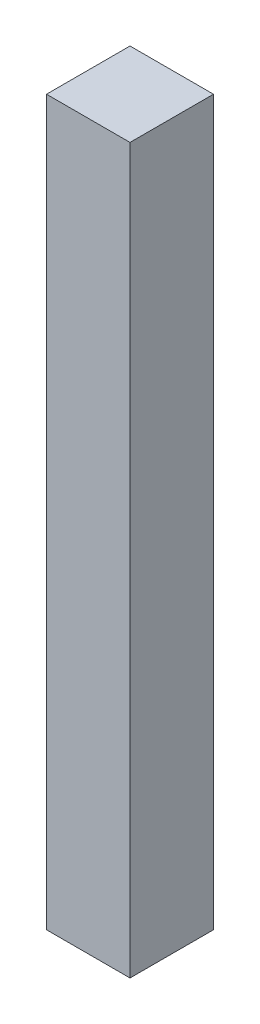
ISO-10303-21;
HEADER;
FILE_DESCRIPTION(('STEP AP214'),'2;1');
FILE_NAME('part.step','',(''),(''),'','','');
FILE_SCHEMA(('AUTOMOTIVE_DESIGN { 1 0 10303 214 1 1 1 1 }'));
ENDSEC;
DATA;
#1=APPLICATION_CONTEXT('core data for automotive mechanical design processes');
#2=APPLICATION_PROTOCOL_DEFINITION('international standard','automotive_design',2000,#1);
#3=PRODUCT_CONTEXT('',#1,'mechanical');
#4=PRODUCT('Part','Part','',(#3));
#5=PRODUCT_RELATED_PRODUCT_CATEGORY('part','',(#4));
#6=PRODUCT_DEFINITION_FORMATION('','',#4);
#7=PRODUCT_DEFINITION_CONTEXT('part definition',#1,'design');
#8=PRODUCT_DEFINITION('design','',#6,#7);
#9=PRODUCT_DEFINITION_SHAPE('','',#8);
#10=(LENGTH_UNIT() NAMED_UNIT(*) SI_UNIT(.MILLI.,.METRE.));
#11=(NAMED_UNIT(*) PLANE_ANGLE_UNIT() SI_UNIT($,.RADIAN.));
#12=(NAMED_UNIT(*) SI_UNIT($,.STERADIAN.) SOLID_ANGLE_UNIT());
#13=UNCERTAINTY_MEASURE_WITH_UNIT(LENGTH_MEASURE(1.E-05),#10,'distance_accuracy_value','');
#14=(GEOMETRIC_REPRESENTATION_CONTEXT(3) GLOBAL_UNCERTAINTY_ASSIGNED_CONTEXT((#13)) GLOBAL_UNIT_ASSIGNED_CONTEXT((#10,
#11,#12)) REPRESENTATION_CONTEXT('',''));
#15=CARTESIAN_POINT('',(0.,0.,0.));
#16=DIRECTION('',(0.,0.,1.));
#17=DIRECTION('',(1.,0.,0.));
#18=AXIS2_PLACEMENT_3D('',#15,#16,#17);
#19=CARTESIAN_POINT('',(-40.0481927710843,260.,-5.36746987951807));
#20=DIRECTION('',(1.,0.,0.));
#21=DIRECTION('',(0.,0.,-1.));
#22=AXIS2_PLACEMENT_3D('',#19,#20,#21);
#23=PLANE('',#22);
#24=DIRECTION('',(0.,0.,1.));
#25=VECTOR('',#24,1.);
#26=CARTESIAN_POINT('',(-40.0481927710843,0.,-5.36746987951807));
#27=LINE('',#26,#25);
#28=CARTESIAN_POINT('',(-40.0481927710843,0.,-5.36746987951807));
#29=VERTEX_POINT('',#28);
#30=CARTESIAN_POINT('',(-40.0481927710843,0.,24.6325301204819));
#31=VERTEX_POINT('',#30);
#32=EDGE_CURVE('E104',#29,#31,#27,.T.);
#33=ORIENTED_EDGE('',*,*,#32,.T.);
#34=DIRECTION('',(0.,-1.,0.));
#35=VECTOR('',#34,1.);
#36=CARTESIAN_POINT('',(-40.0481927710843,260.,24.6325301204819));
#37=LINE('',#36,#35);
#38=CARTESIAN_POINT('',(-40.0481927710843,260.,24.6325301204819));
#39=VERTEX_POINT('',#38);
#40=EDGE_CURVE('E11',#39,#31,#37,.T.);
#41=ORIENTED_EDGE('',*,*,#40,.F.);
#42=DIRECTION('',(0.,0.,1.));
#43=VECTOR('',#42,1.);
#44=CARTESIAN_POINT('',(-40.0481927710843,260.,-5.36746987951807));
#45=LINE('',#44,#43);
#46=CARTESIAN_POINT('',(-40.0481927710843,260.,-5.36746987951807));
#47=VERTEX_POINT('',#46);
#48=EDGE_CURVE('E92',#47,#39,#45,.T.);
#49=ORIENTED_EDGE('',*,*,#48,.F.);
#50=DIRECTION('',(0.,-1.,0.));
#51=VECTOR('',#50,1.);
#52=CARTESIAN_POINT('',(-40.0481927710843,260.,-5.36746987951807));
#53=LINE('',#52,#51);
#54=EDGE_CURVE('E100',#47,#29,#53,.T.);
#55=ORIENTED_EDGE('',*,*,#54,.T.);
#56=EDGE_LOOP('',(#33,#41,#49,#55));
#57=FACE_BOUND('',#56,.T.);
#58=ADVANCED_FACE('F41',(#57),#23,.F.);
#59=CARTESIAN_POINT('',(-40.0481927710843,260.,24.6325301204819));
#60=DIRECTION('',(0.,0.,-1.));
#61=DIRECTION('',(-1.,0.,0.));
#62=AXIS2_PLACEMENT_3D('',#59,#60,#61);
#63=PLANE('',#62);
#64=DIRECTION('',(1.,0.,0.));
#65=VECTOR('',#64,1.);
#66=CARTESIAN_POINT('',(-40.0481927710843,0.,24.6325301204819));
#67=LINE('',#66,#65);
#68=CARTESIAN_POINT('',(-10.0481927710843,0.,24.6325301204819));
#69=VERTEX_POINT('',#68);
#70=EDGE_CURVE('E96',#31,#69,#67,.T.);
#71=ORIENTED_EDGE('',*,*,#70,.T.);
#72=DIRECTION('',(0.,-1.,0.));
#73=VECTOR('',#72,1.);
#74=CARTESIAN_POINT('',(-10.0481927710843,260.,24.6325301204819));
#75=LINE('',#74,#73);
#76=CARTESIAN_POINT('',(-10.0481927710843,260.,24.6325301204819));
#77=VERTEX_POINT('',#76);
#78=EDGE_CURVE('E49',#77,#69,#75,.T.);
#79=ORIENTED_EDGE('',*,*,#78,.F.);
#80=DIRECTION('',(1.,0.,0.));
#81=VECTOR('',#80,1.);
#82=CARTESIAN_POINT('',(-40.0481927710843,260.,24.6325301204819));
#83=LINE('',#82,#81);
#84=EDGE_CURVE('E87',#39,#77,#83,.T.);
#85=ORIENTED_EDGE('',*,*,#84,.F.);
#86=ORIENTED_EDGE('',*,*,#40,.T.);
#87=EDGE_LOOP('',(#71,#79,#85,#86));
#88=FACE_BOUND('',#87,.T.);
#89=ADVANCED_FACE('F95',(#88),#63,.F.);
#90=CARTESIAN_POINT('',(-10.0481927710843,260.,-5.36746987951807));
#91=DIRECTION('',(-1.,0.,0.));
#92=DIRECTION('',(0.,0.,1.));
#93=AXIS2_PLACEMENT_3D('',#90,#91,#92);
#94=PLANE('',#93);
#95=DIRECTION('',(0.,0.,-1.));
#96=VECTOR('',#95,1.);
#97=CARTESIAN_POINT('',(-10.0481927710843,0.,-5.36746987951807));
#98=LINE('',#97,#96);
#99=CARTESIAN_POINT('',(-10.0481927710843,0.,-5.36746987951807));
#100=VERTEX_POINT('',#99);
#101=EDGE_CURVE('E74',#69,#100,#98,.T.);
#102=ORIENTED_EDGE('',*,*,#101,.T.);
#103=DIRECTION('',(0.,-1.,0.));
#104=VECTOR('',#103,1.);
#105=CARTESIAN_POINT('',(-10.0481927710843,260.,-5.36746987951807));
#106=LINE('',#105,#104);
#107=CARTESIAN_POINT('',(-10.0481927710843,260.,-5.36746987951807));
#108=VERTEX_POINT('',#107);
#109=EDGE_CURVE('E97',#108,#100,#106,.T.);
#110=ORIENTED_EDGE('',*,*,#109,.F.);
#111=DIRECTION('',(0.,0.,-1.));
#112=VECTOR('',#111,1.);
#113=CARTESIAN_POINT('',(-10.0481927710843,260.,-5.36746987951807));
#114=LINE('',#113,#112);
#115=EDGE_CURVE('E90',#77,#108,#114,.T.);
#116=ORIENTED_EDGE('',*,*,#115,.F.);
#117=ORIENTED_EDGE('',*,*,#78,.T.);
#118=EDGE_LOOP('',(#102,#110,#116,#117));
#119=FACE_BOUND('',#118,.T.);
#120=ADVANCED_FACE('F98',(#119),#94,.F.);
#121=CARTESIAN_POINT('',(-40.0481927710843,260.,-5.36746987951807));
#122=DIRECTION('',(0.,0.,1.));
#123=DIRECTION('',(1.,0.,0.));
#124=AXIS2_PLACEMENT_3D('',#121,#122,#123);
#125=PLANE('',#124);
#126=DIRECTION('',(-1.,0.,0.));
#127=VECTOR('',#126,1.);
#128=CARTESIAN_POINT('',(-40.0481927710843,0.,-5.36746987951807));
#129=LINE('',#128,#127);
#130=EDGE_CURVE('E80',#100,#29,#129,.T.);
#131=ORIENTED_EDGE('',*,*,#130,.T.);
#132=ORIENTED_EDGE('',*,*,#54,.F.);
#133=DIRECTION('',(-1.,0.,0.));
#134=VECTOR('',#133,1.);
#135=CARTESIAN_POINT('',(-40.0481927710843,260.,-5.36746987951807));
#136=LINE('',#135,#134);
#137=EDGE_CURVE('E57',#108,#47,#136,.T.);
#138=ORIENTED_EDGE('',*,*,#137,.F.);
#139=ORIENTED_EDGE('',*,*,#109,.T.);
#140=EDGE_LOOP('',(#131,#132,#138,#139));
#141=FACE_BOUND('',#140,.T.);
#142=ADVANCED_FACE('F111',(#141),#125,.F.);
#143=CARTESIAN_POINT('',(0.,260.,0.));
#144=DIRECTION('',(0.,1.,0.));
#145=DIRECTION('',(0.,0.,1.));
#146=AXIS2_PLACEMENT_3D('',#143,#144,#145);
#147=PLANE('',#146);
#148=ORIENTED_EDGE('',*,*,#48,.T.);
#149=ORIENTED_EDGE('',*,*,#84,.T.);
#150=ORIENTED_EDGE('',*,*,#115,.T.);
#151=ORIENTED_EDGE('',*,*,#137,.T.);
#152=EDGE_LOOP('',(#148,#149,#150,#151));
#153=FACE_BOUND('',#152,.T.);
#154=ADVANCED_FACE('F88',(#153),#147,.T.);
#155=CARTESIAN_POINT('',(0.,0.,0.));
#156=DIRECTION('',(0.,1.,0.));
#157=DIRECTION('',(0.,0.,1.));
#158=AXIS2_PLACEMENT_3D('',#155,#156,#157);
#159=PLANE('',#158);
#160=ORIENTED_EDGE('',*,*,#32,.F.);
#161=ORIENTED_EDGE('',*,*,#130,.F.);
#162=ORIENTED_EDGE('',*,*,#101,.F.);
#163=ORIENTED_EDGE('',*,*,#70,.F.);
#164=EDGE_LOOP('',(#160,#161,#162,#163));
#165=FACE_BOUND('',#164,.T.);
#166=ADVANCED_FACE('F114',(#165),#159,.F.);
#167=CLOSED_SHELL('',(#58,#89,#120,#142,#154,#166));
#168=MANIFOLD_SOLID_BREP('B2',#167);
#169=ADVANCED_BREP_SHAPE_REPRESENTATION('',(#18,#168),#14);
#170=SHAPE_DEFINITION_REPRESENTATION(#9,#169);
ENDSEC;
END-ISO-10303-21;
